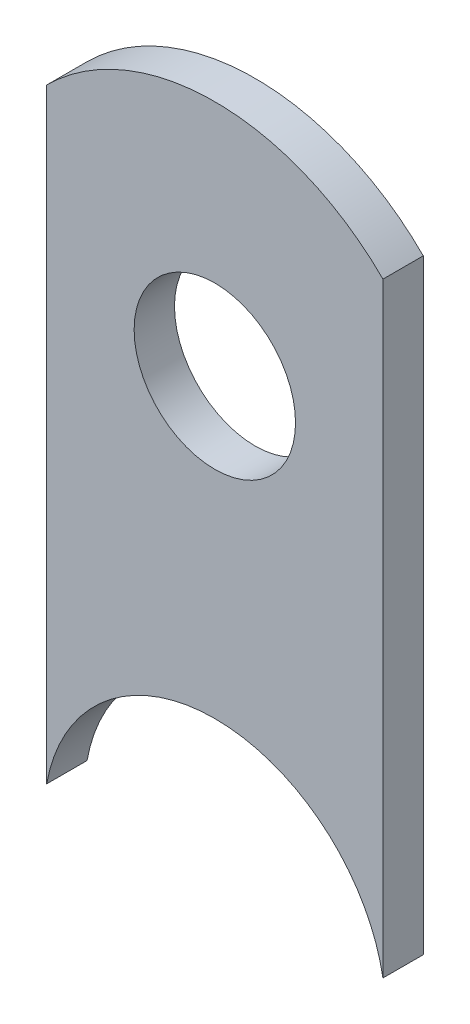
ISO-10303-21;
HEADER;
FILE_DESCRIPTION(('STEP AP214'),'2;1');
FILE_NAME('part.step','',(''),(''),'','','');
FILE_SCHEMA(('AUTOMOTIVE_DESIGN { 1 0 10303 214 1 1 1 1 }'));
ENDSEC;
DATA;
#1=APPLICATION_CONTEXT('core data for automotive mechanical design processes');
#2=APPLICATION_PROTOCOL_DEFINITION('international standard','automotive_design',2000,#1);
#3=PRODUCT_CONTEXT('',#1,'mechanical');
#4=PRODUCT('Part','Part','',(#3));
#5=PRODUCT_RELATED_PRODUCT_CATEGORY('part','',(#4));
#6=PRODUCT_DEFINITION_FORMATION('','',#4);
#7=PRODUCT_DEFINITION_CONTEXT('part definition',#1,'design');
#8=PRODUCT_DEFINITION('design','',#6,#7);
#9=PRODUCT_DEFINITION_SHAPE('','',#8);
#10=(LENGTH_UNIT() NAMED_UNIT(*) SI_UNIT(.MILLI.,.METRE.));
#11=(NAMED_UNIT(*) PLANE_ANGLE_UNIT() SI_UNIT($,.RADIAN.));
#12=(NAMED_UNIT(*) SI_UNIT($,.STERADIAN.) SOLID_ANGLE_UNIT());
#13=UNCERTAINTY_MEASURE_WITH_UNIT(LENGTH_MEASURE(1.E-05),#10,'distance_accuracy_value','');
#14=(GEOMETRIC_REPRESENTATION_CONTEXT(3) GLOBAL_UNCERTAINTY_ASSIGNED_CONTEXT((#13)) GLOBAL_UNIT_ASSIGNED_CONTEXT((#10,
#11,#12)) REPRESENTATION_CONTEXT('',''));
#15=CARTESIAN_POINT('',(0.,0.,0.));
#16=DIRECTION('',(0.,0.,1.));
#17=DIRECTION('',(1.,0.,0.));
#18=AXIS2_PLACEMENT_3D('',#15,#16,#17);
#19=CARTESIAN_POINT('',(0.,-24.7449944320643,-3.));
#20=DIRECTION('',(0.,0.,1.));
#21=DIRECTION('',(1.,0.,0.));
#22=AXIS2_PLACEMENT_3D('',#19,#20,#21);
#23=CYLINDRICAL_SURFACE('',#22,12.7);
#24=CARTESIAN_POINT('',(0.,-24.7449944320643,0.));
#25=DIRECTION('',(0.,0.,-1.));
#26=DIRECTION('',(-1.,0.,0.));
#27=AXIS2_PLACEMENT_3D('',#24,#25,#26);
#28=CIRCLE('',#27,12.7);
#29=CARTESIAN_POINT('',(-12.5,-22.5,0.));
#30=VERTEX_POINT('',#29);
#31=CARTESIAN_POINT('',(12.5,-22.5,0.));
#32=VERTEX_POINT('',#31);
#33=EDGE_CURVE('E110',#30,#32,#28,.T.);
#34=ORIENTED_EDGE('',*,*,#33,.F.);
#35=DIRECTION('',(0.,0.,1.));
#36=VECTOR('',#35,1.);
#37=CARTESIAN_POINT('',(-12.5,-22.5,-3.));
#38=LINE('',#37,#36);
#39=CARTESIAN_POINT('',(-12.5,-22.5,-3.));
#40=VERTEX_POINT('',#39);
#41=EDGE_CURVE('E11',#40,#30,#38,.T.);
#42=ORIENTED_EDGE('',*,*,#41,.F.);
#43=CARTESIAN_POINT('',(0.,-24.7449944320643,-3.));
#44=DIRECTION('',(0.,0.,-1.));
#45=DIRECTION('',(-1.,0.,0.));
#46=AXIS2_PLACEMENT_3D('',#43,#44,#45);
#47=CIRCLE('',#46,12.7);
#48=CARTESIAN_POINT('',(12.5,-22.5,-3.));
#49=VERTEX_POINT('',#48);
#50=EDGE_CURVE('E103',#40,#49,#47,.T.);
#51=ORIENTED_EDGE('',*,*,#50,.T.);
#52=DIRECTION('',(0.,0.,1.));
#53=VECTOR('',#52,1.);
#54=CARTESIAN_POINT('',(12.5,-22.5,-3.));
#55=LINE('',#54,#53);
#56=EDGE_CURVE('E48',#49,#32,#55,.T.);
#57=ORIENTED_EDGE('',*,*,#56,.T.);
#58=EDGE_LOOP('',(#34,#42,#51,#57));
#59=FACE_BOUND('',#58,.T.);
#60=ADVANCED_FACE('F45',(#59),#23,.F.);
#61=CARTESIAN_POINT('',(-12.5,22.5,-3.));
#62=DIRECTION('',(-1.,0.,0.));
#63=DIRECTION('',(0.,-1.,0.));
#64=AXIS2_PLACEMENT_3D('',#61,#62,#63);
#65=PLANE('',#64);
#66=DIRECTION('',(0.,-1.,0.));
#67=VECTOR('',#66,1.);
#68=CARTESIAN_POINT('',(-12.5,22.5,0.));
#69=LINE('',#68,#67);
#70=CARTESIAN_POINT('',(-12.5,22.5,0.));
#71=VERTEX_POINT('',#70);
#72=EDGE_CURVE('E105',#71,#30,#69,.T.);
#73=ORIENTED_EDGE('',*,*,#72,.F.);
#74=DIRECTION('',(0.,0.,1.));
#75=VECTOR('',#74,1.);
#76=CARTESIAN_POINT('',(-12.5,22.5,-3.));
#77=LINE('',#76,#75);
#78=CARTESIAN_POINT('',(-12.5,22.5,-3.));
#79=VERTEX_POINT('',#78);
#80=EDGE_CURVE('E54',#79,#71,#77,.T.);
#81=ORIENTED_EDGE('',*,*,#80,.F.);
#82=DIRECTION('',(0.,-1.,0.));
#83=VECTOR('',#82,1.);
#84=CARTESIAN_POINT('',(-12.5,22.5,-3.));
#85=LINE('',#84,#83);
#86=EDGE_CURVE('E100',#79,#40,#85,.T.);
#87=ORIENTED_EDGE('',*,*,#86,.T.);
#88=ORIENTED_EDGE('',*,*,#41,.T.);
#89=EDGE_LOOP('',(#73,#81,#87,#88));
#90=FACE_BOUND('',#89,.T.);
#91=ADVANCED_FACE('F121',(#90),#65,.T.);
#92=CARTESIAN_POINT('',(0.,9.99999999999985,-3.));
#93=DIRECTION('',(0.,0.,1.));
#94=DIRECTION('',(1.,0.,0.));
#95=AXIS2_PLACEMENT_3D('',#92,#93,#94);
#96=CYLINDRICAL_SURFACE('',#95,17.6776695296638);
#97=CARTESIAN_POINT('',(0.,9.99999999999985,0.));
#98=DIRECTION('',(0.,0.,1.));
#99=DIRECTION('',(-1.,0.,0.));
#100=AXIS2_PLACEMENT_3D('',#97,#98,#99);
#101=CIRCLE('',#100,17.6776695296638);
#102=CARTESIAN_POINT('',(12.5,22.5,0.));
#103=VERTEX_POINT('',#102);
#104=EDGE_CURVE('E95',#103,#71,#101,.T.);
#105=ORIENTED_EDGE('',*,*,#104,.F.);
#106=DIRECTION('',(0.,0.,1.));
#107=VECTOR('',#106,1.);
#108=CARTESIAN_POINT('',(12.5,22.5,-3.));
#109=LINE('',#108,#107);
#110=CARTESIAN_POINT('',(12.5,22.5,-3.));
#111=VERTEX_POINT('',#110);
#112=EDGE_CURVE('E90',#111,#103,#109,.T.);
#113=ORIENTED_EDGE('',*,*,#112,.F.);
#114=CARTESIAN_POINT('',(0.,9.99999999999985,-3.));
#115=DIRECTION('',(0.,0.,1.));
#116=DIRECTION('',(-1.,0.,0.));
#117=AXIS2_PLACEMENT_3D('',#114,#115,#116);
#118=CIRCLE('',#117,17.6776695296638);
#119=EDGE_CURVE('E93',#111,#79,#118,.T.);
#120=ORIENTED_EDGE('',*,*,#119,.T.);
#121=ORIENTED_EDGE('',*,*,#80,.T.);
#122=EDGE_LOOP('',(#105,#113,#120,#121));
#123=FACE_BOUND('',#122,.T.);
#124=ADVANCED_FACE('F92',(#123),#96,.T.);
#125=CARTESIAN_POINT('',(12.5,22.5,-3.));
#126=DIRECTION('',(1.,0.,0.));
#127=DIRECTION('',(0.,1.,0.));
#128=AXIS2_PLACEMENT_3D('',#125,#126,#127);
#129=PLANE('',#128);
#130=DIRECTION('',(0.,1.,0.));
#131=VECTOR('',#130,1.);
#132=CARTESIAN_POINT('',(12.5,22.5,0.));
#133=LINE('',#132,#131);
#134=EDGE_CURVE('E113',#32,#103,#133,.T.);
#135=ORIENTED_EDGE('',*,*,#134,.F.);
#136=ORIENTED_EDGE('',*,*,#56,.F.);
#137=DIRECTION('',(0.,1.,0.));
#138=VECTOR('',#137,1.);
#139=CARTESIAN_POINT('',(12.5,22.5,-3.));
#140=LINE('',#139,#138);
#141=EDGE_CURVE('E99',#49,#111,#140,.T.);
#142=ORIENTED_EDGE('',*,*,#141,.T.);
#143=ORIENTED_EDGE('',*,*,#112,.T.);
#144=EDGE_LOOP('',(#135,#136,#142,#143));
#145=FACE_BOUND('',#144,.T.);
#146=ADVANCED_FACE('F102',(#145),#129,.T.);
#147=CARTESIAN_POINT('',(0.,-24.7449944320643,-3.));
#148=DIRECTION('',(0.,0.,-1.));
#149=DIRECTION('',(-1.,0.,0.));
#150=AXIS2_PLACEMENT_3D('',#147,#148,#149);
#151=PLANE('',#150);
#152=CARTESIAN_POINT('',(0.,9.99999999999985,-3.));
#153=DIRECTION('',(0.,0.,1.));
#154=DIRECTION('',(1.,0.,0.));
#155=AXIS2_PLACEMENT_3D('',#152,#153,#154);
#156=CIRCLE('',#155,6.);
#157=CARTESIAN_POINT('',(5.99999999999999,9.99999999999985,-3.));
#158=VERTEX_POINT('',#157);
#159=EDGE_CURVE('E114',#158,#158,#156,.T.);
#160=ORIENTED_EDGE('',*,*,#159,.T.);
#161=EDGE_LOOP('',(#160));
#162=FACE_BOUND('',#161,.T.);
#163=ORIENTED_EDGE('',*,*,#50,.F.);
#164=ORIENTED_EDGE('',*,*,#86,.F.);
#165=ORIENTED_EDGE('',*,*,#119,.F.);
#166=ORIENTED_EDGE('',*,*,#141,.F.);
#167=EDGE_LOOP('',(#163,#164,#165,#166));
#168=FACE_BOUND('',#167,.T.);
#169=ADVANCED_FACE('F98',(#162,#168),#151,.T.);
#170=CARTESIAN_POINT('',(0.,-24.7449944320643,0.));
#171=DIRECTION('',(0.,0.,-1.));
#172=DIRECTION('',(-1.,0.,0.));
#173=AXIS2_PLACEMENT_3D('',#170,#171,#172);
#174=PLANE('',#173);
#175=CARTESIAN_POINT('',(0.,9.99999999999985,0.));
#176=DIRECTION('',(0.,0.,1.));
#177=DIRECTION('',(1.,0.,0.));
#178=AXIS2_PLACEMENT_3D('',#175,#176,#177);
#179=CIRCLE('',#178,6.);
#180=CARTESIAN_POINT('',(5.99999999999999,9.99999999999985,0.));
#181=VERTEX_POINT('',#180);
#182=EDGE_CURVE('E151',#181,#181,#179,.T.);
#183=ORIENTED_EDGE('',*,*,#182,.F.);
#184=EDGE_LOOP('',(#183));
#185=FACE_BOUND('',#184,.T.);
#186=ORIENTED_EDGE('',*,*,#33,.T.);
#187=ORIENTED_EDGE('',*,*,#134,.T.);
#188=ORIENTED_EDGE('',*,*,#104,.T.);
#189=ORIENTED_EDGE('',*,*,#72,.T.);
#190=EDGE_LOOP('',(#186,#187,#188,#189));
#191=FACE_BOUND('',#190,.T.);
#192=ADVANCED_FACE('F120',(#185,#191),#174,.F.);
#193=CARTESIAN_POINT('',(0.,9.99999999999985,-3.));
#194=DIRECTION('',(0.,0.,1.));
#195=DIRECTION('',(1.,0.,0.));
#196=AXIS2_PLACEMENT_3D('',#193,#194,#195);
#197=CYLINDRICAL_SURFACE('',#196,6.);
#198=ORIENTED_EDGE('',*,*,#159,.F.);
#199=EDGE_LOOP('',(#198));
#200=FACE_BOUND('',#199,.T.);
#201=ORIENTED_EDGE('',*,*,#182,.T.);
#202=EDGE_LOOP('',(#201));
#203=FACE_BOUND('',#202,.T.);
#204=ADVANCED_FACE('F139',(#200,#203),#197,.F.);
#205=CLOSED_SHELL('',(#60,#91,#124,#146,#169,#192,#204));
#206=MANIFOLD_SOLID_BREP('B2',#205);
#207=ADVANCED_BREP_SHAPE_REPRESENTATION('',(#18,#206),#14);
#208=SHAPE_DEFINITION_REPRESENTATION(#9,#207);
ENDSEC;
END-ISO-10303-21;
